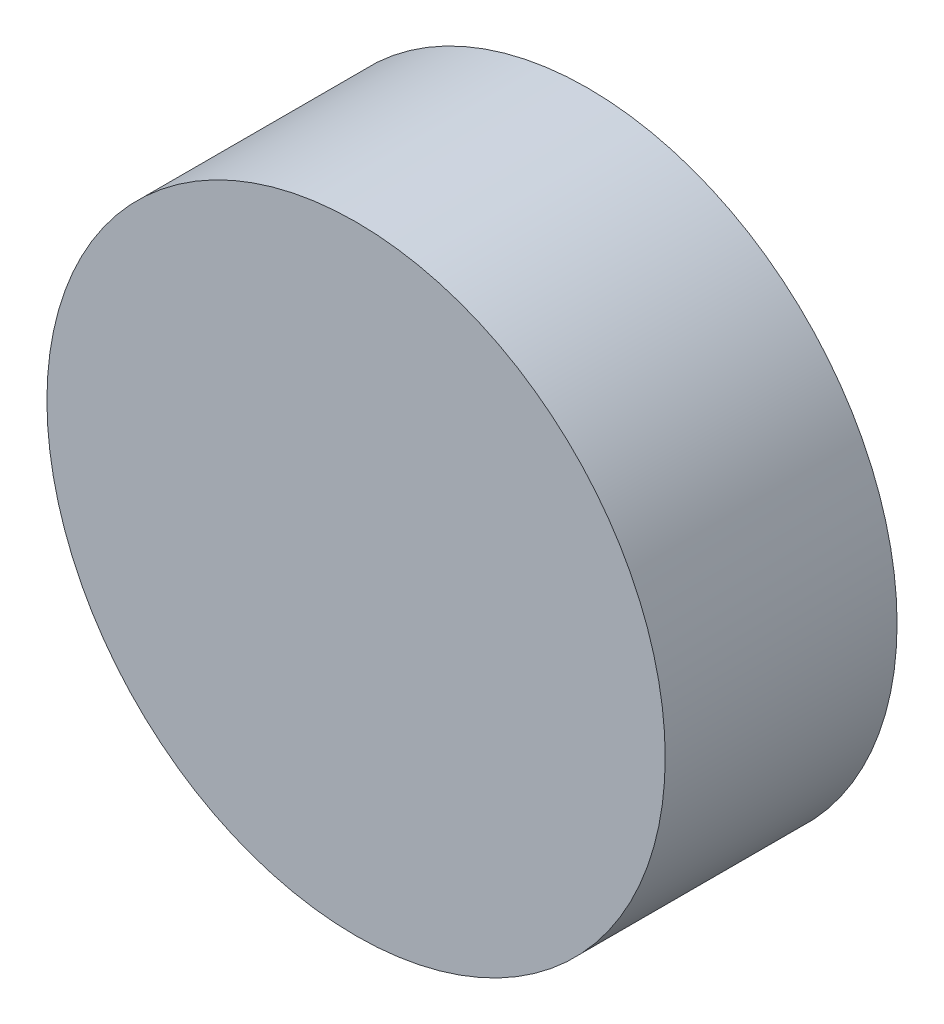
ISO-10303-21;
HEADER;
FILE_DESCRIPTION(('STEP AP214'),'2;1');
FILE_NAME('part.step','',(''),(''),'','','');
FILE_SCHEMA(('AUTOMOTIVE_DESIGN { 1 0 10303 214 1 1 1 1 }'));
ENDSEC;
DATA;
#1=APPLICATION_CONTEXT('core data for automotive mechanical design processes');
#2=APPLICATION_PROTOCOL_DEFINITION('international standard','automotive_design',2000,#1);
#3=PRODUCT_CONTEXT('',#1,'mechanical');
#4=PRODUCT('Part','Part','',(#3));
#5=PRODUCT_RELATED_PRODUCT_CATEGORY('part','',(#4));
#6=PRODUCT_DEFINITION_FORMATION('','',#4);
#7=PRODUCT_DEFINITION_CONTEXT('part definition',#1,'design');
#8=PRODUCT_DEFINITION('design','',#6,#7);
#9=PRODUCT_DEFINITION_SHAPE('','',#8);
#10=(LENGTH_UNIT() NAMED_UNIT(*) SI_UNIT(.MILLI.,.METRE.));
#11=(NAMED_UNIT(*) PLANE_ANGLE_UNIT() SI_UNIT($,.RADIAN.));
#12=(NAMED_UNIT(*) SI_UNIT($,.STERADIAN.) SOLID_ANGLE_UNIT());
#13=UNCERTAINTY_MEASURE_WITH_UNIT(LENGTH_MEASURE(1.E-05),#10,'distance_accuracy_value','');
#14=(GEOMETRIC_REPRESENTATION_CONTEXT(3) GLOBAL_UNCERTAINTY_ASSIGNED_CONTEXT((#13)) GLOBAL_UNIT_ASSIGNED_CONTEXT((#10,
#11,#12)) REPRESENTATION_CONTEXT('',''));
#15=CARTESIAN_POINT('',(0.,0.,0.));
#16=DIRECTION('',(0.,0.,1.));
#17=DIRECTION('',(1.,0.,0.));
#18=AXIS2_PLACEMENT_3D('',#15,#16,#17);
#19=CARTESIAN_POINT('',(0.,0.,3.81));
#20=DIRECTION('',(0.,0.,-1.));
#21=DIRECTION('',(-1.,0.,0.));
#22=AXIS2_PLACEMENT_3D('',#19,#20,#21);
#23=CYLINDRICAL_SURFACE('',#22,5.08);
#24=CARTESIAN_POINT('',(0.,0.,3.81));
#25=DIRECTION('',(0.,0.,1.));
#26=DIRECTION('',(1.,0.,0.));
#27=AXIS2_PLACEMENT_3D('',#24,#25,#26);
#28=CIRCLE('',#27,5.08);
#29=CARTESIAN_POINT('',(-5.08,0.,3.81));
#30=VERTEX_POINT('',#29);
#31=EDGE_CURVE('E10',#30,#30,#28,.T.);
#32=CARTESIAN_POINT('',(0.,0.,0.));
#33=DIRECTION('',(0.,0.,1.));
#34=DIRECTION('',(1.,0.,0.));
#35=AXIS2_PLACEMENT_3D('',#32,#33,#34);
#36=CIRCLE('',#35,5.08);
#37=CARTESIAN_POINT('',(-5.08,0.,0.));
#38=VERTEX_POINT('',#37);
#39=EDGE_CURVE('E35',#38,#38,#36,.T.);
#40=CARTESIAN_POINT('',(-5.08,0.,3.81));
#41=CARTESIAN_POINT('',(-5.08,0.,3.7703125));
#42=CARTESIAN_POINT('',(-5.08,0.,3.730625));
#43=CARTESIAN_POINT('',(-5.08,0.,3.65125));
#44=CARTESIAN_POINT('',(-5.08,0.,3.6115625));
#45=CARTESIAN_POINT('',(-5.08,0.,3.5321875));
#46=CARTESIAN_POINT('',(-5.08,0.,3.4925));
#47=CARTESIAN_POINT('',(-5.08,0.,3.413125));
#48=CARTESIAN_POINT('',(-5.08,0.,3.3734375));
#49=CARTESIAN_POINT('',(-5.08,0.,3.2940625));
#50=CARTESIAN_POINT('',(-5.08,0.,3.254375));
#51=CARTESIAN_POINT('',(-5.08,0.,3.175));
#52=CARTESIAN_POINT('',(-5.08,0.,3.1353125));
#53=CARTESIAN_POINT('',(-5.08,0.,3.0559375));
#54=CARTESIAN_POINT('',(-5.08,0.,3.01625));
#55=CARTESIAN_POINT('',(-5.08,0.,2.936875));
#56=CARTESIAN_POINT('',(-5.08,0.,2.8971875));
#57=CARTESIAN_POINT('',(-5.08,0.,2.8178125));
#58=CARTESIAN_POINT('',(-5.08,0.,2.778125));
#59=CARTESIAN_POINT('',(-5.08,0.,2.69875));
#60=CARTESIAN_POINT('',(-5.08,0.,2.6590625));
#61=CARTESIAN_POINT('',(-5.08,0.,2.5796875));
#62=CARTESIAN_POINT('',(-5.08,0.,2.54));
#63=CARTESIAN_POINT('',(-5.08,0.,2.460625));
#64=CARTESIAN_POINT('',(-5.08,0.,2.4209375));
#65=CARTESIAN_POINT('',(-5.08,0.,2.3415625));
#66=CARTESIAN_POINT('',(-5.08,0.,2.301875));
#67=CARTESIAN_POINT('',(-5.08,0.,2.2225));
#68=CARTESIAN_POINT('',(-5.08,0.,2.1828125));
#69=CARTESIAN_POINT('',(-5.08,0.,2.1034375));
#70=CARTESIAN_POINT('',(-5.08,0.,2.06375));
#71=CARTESIAN_POINT('',(-5.08,0.,1.984375));
#72=CARTESIAN_POINT('',(-5.08,0.,1.9446875));
#73=CARTESIAN_POINT('',(-5.08,0.,1.8653125));
#74=CARTESIAN_POINT('',(-5.08,0.,1.825625));
#75=CARTESIAN_POINT('',(-5.08,0.,1.74625));
#76=CARTESIAN_POINT('',(-5.08,0.,1.7065625));
#77=CARTESIAN_POINT('',(-5.08,0.,1.6271875));
#78=CARTESIAN_POINT('',(-5.08,0.,1.5875));
#79=CARTESIAN_POINT('',(-5.08,0.,1.508125));
#80=CARTESIAN_POINT('',(-5.08,0.,1.4684375));
#81=CARTESIAN_POINT('',(-5.08,0.,1.3890625));
#82=CARTESIAN_POINT('',(-5.08,0.,1.349375));
#83=CARTESIAN_POINT('',(-5.08,0.,1.27));
#84=CARTESIAN_POINT('',(-5.08,0.,1.2303125));
#85=CARTESIAN_POINT('',(-5.08,0.,1.1509375));
#86=CARTESIAN_POINT('',(-5.08,0.,1.11125));
#87=CARTESIAN_POINT('',(-5.08,0.,1.031875));
#88=CARTESIAN_POINT('',(-5.08,0.,0.9921875));
#89=CARTESIAN_POINT('',(-5.08,0.,0.9128125));
#90=CARTESIAN_POINT('',(-5.08,0.,0.873125));
#91=CARTESIAN_POINT('',(-5.08,0.,0.79375));
#92=CARTESIAN_POINT('',(-5.08,0.,0.7540625));
#93=CARTESIAN_POINT('',(-5.08,0.,0.6746875));
#94=CARTESIAN_POINT('',(-5.08,0.,0.635));
#95=CARTESIAN_POINT('',(-5.08,0.,0.555625));
#96=CARTESIAN_POINT('',(-5.08,0.,0.5159375));
#97=CARTESIAN_POINT('',(-5.08,0.,0.4365625));
#98=CARTESIAN_POINT('',(-5.08,0.,0.396875));
#99=CARTESIAN_POINT('',(-5.08,0.,0.3175));
#100=CARTESIAN_POINT('',(-5.08,0.,0.2778125));
#101=CARTESIAN_POINT('',(-5.08,0.,0.1984375));
#102=CARTESIAN_POINT('',(-5.08,0.,0.15875));
#103=CARTESIAN_POINT('',(-5.08,0.,0.0793749999999999));
#104=CARTESIAN_POINT('',(-5.08,0.,0.0396874999999999));
#105=CARTESIAN_POINT('',(-5.08,0.,0.));
#106=B_SPLINE_CURVE_WITH_KNOTS('',3,(#40,#41,#42,#43,#44,#45,#46,#47,#48,#49,#50,#51,#52,#53,
#54,#55,#56,#57,#58,#59,#60,#61,#62,#63,#64,#65,#66,#67,#68,#69,#70,#71,#72,#73,#74,#75,#76,#77,
#78,#79,#80,#81,#82,#83,#84,#85,#86,#87,#88,#89,#90,#91,#92,#93,#94,#95,#96,#97,#98,#99,#100,
#101,#102,#103,#104,#105),.UNSPECIFIED.,.F.,.F.,(4,2,2,2,2,2,2,2,2,2,2,2,2,2,2,2,2,2,2,2,2,2,2,
2,2,2,2,2,2,2,2,2,4),(0.,0.1190625,0.238125,0.3571875,0.47625,0.5953125,0.714375,0.8334375,
0.9525,1.0715625,1.190625,1.3096875,1.42875,1.5478125,1.666875,1.7859375,1.905,2.0240625,
2.143125,2.2621875,2.38125,2.5003125,2.619375,2.7384375,2.8575,2.9765625,3.095625,3.2146875,
3.33375,3.4528125,3.571875,3.6909375,3.81),.UNSPECIFIED.);
#107=EDGE_CURVE('BSEAM32',#30,#38,#106,.T.);
#108=ORIENTED_EDGE('',*,*,#31,.F.);
#109=ORIENTED_EDGE('',*,*,#39,.T.);
#110=ORIENTED_EDGE('',*,*,#107,.T.);
#111=ORIENTED_EDGE('',*,*,#107,.F.);
#112=EDGE_LOOP('',(#108,#110,#109,#111));
#113=FACE_BOUND('',#112,.T.);
#114=ADVANCED_FACE('F32',(#113),#23,.T.);
#115=CARTESIAN_POINT('',(0.,0.,3.81));
#116=DIRECTION('',(0.,0.,1.));
#117=DIRECTION('',(1.,0.,0.));
#118=AXIS2_PLACEMENT_3D('',#115,#116,#117);
#119=PLANE('',#118);
#120=ORIENTED_EDGE('',*,*,#31,.T.);
#121=EDGE_LOOP('',(#120));
#122=FACE_BOUND('',#121,.T.);
#123=ADVANCED_FACE('F47',(#122),#119,.T.);
#124=CARTESIAN_POINT('',(0.,0.,0.));
#125=DIRECTION('',(0.,0.,1.));
#126=DIRECTION('',(1.,0.,0.));
#127=AXIS2_PLACEMENT_3D('',#124,#125,#126);
#128=PLANE('',#127);
#129=ORIENTED_EDGE('',*,*,#39,.F.);
#130=EDGE_LOOP('',(#129));
#131=FACE_BOUND('',#130,.T.);
#132=ADVANCED_FACE('F45',(#131),#128,.F.);
#133=CLOSED_SHELL('',(#114,#123,#132));
#134=MANIFOLD_SOLID_BREP('B2',#133);
#135=ADVANCED_BREP_SHAPE_REPRESENTATION('',(#18,#134),#14);
#136=SHAPE_DEFINITION_REPRESENTATION(#9,#135);
ENDSEC;
END-ISO-10303-21;
